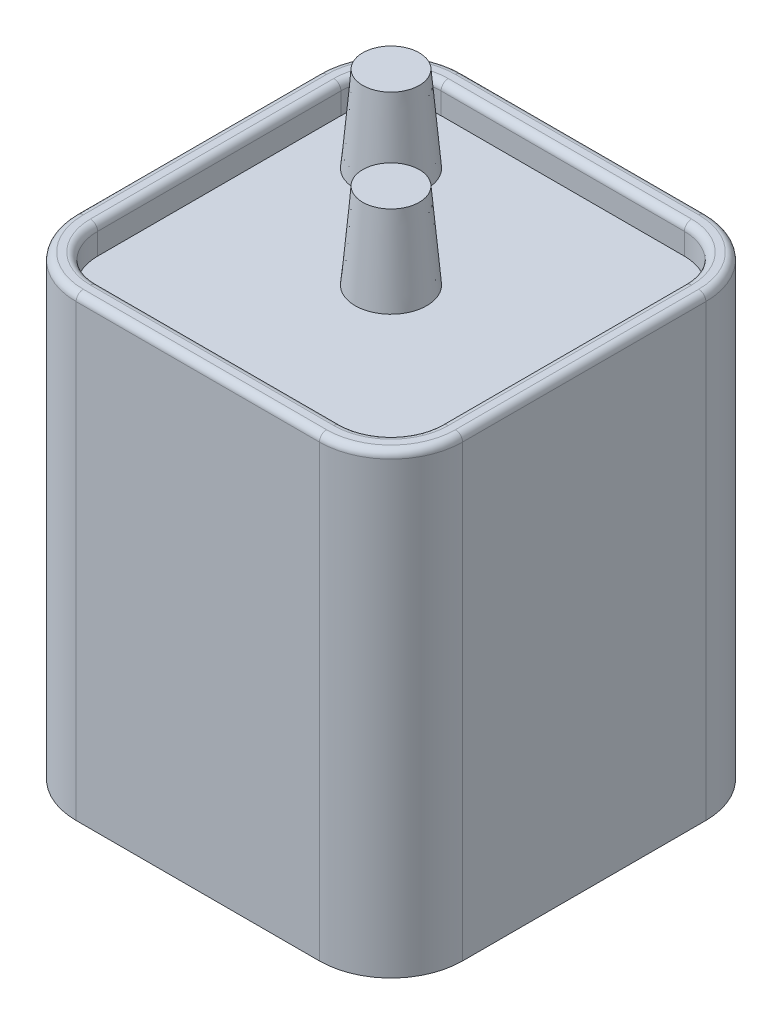
ISO-10303-21;
HEADER;
FILE_DESCRIPTION(('STEP AP214'),'2;1');
FILE_NAME('part.step','',(''),(''),'','','');
FILE_SCHEMA(('AUTOMOTIVE_DESIGN { 1 0 10303 214 1 1 1 1 }'));
ENDSEC;
DATA;
#1=APPLICATION_CONTEXT('core data for automotive mechanical design processes');
#2=APPLICATION_PROTOCOL_DEFINITION('international standard','automotive_design',2000,#1);
#3=PRODUCT_CONTEXT('',#1,'mechanical');
#4=PRODUCT('Part','Part','',(#3));
#5=PRODUCT_RELATED_PRODUCT_CATEGORY('part','',(#4));
#6=PRODUCT_DEFINITION_FORMATION('','',#4);
#7=PRODUCT_DEFINITION_CONTEXT('part definition',#1,'design');
#8=PRODUCT_DEFINITION('design','',#6,#7);
#9=PRODUCT_DEFINITION_SHAPE('','',#8);
#10=(LENGTH_UNIT() NAMED_UNIT(*) SI_UNIT(.MILLI.,.METRE.));
#11=(NAMED_UNIT(*) PLANE_ANGLE_UNIT() SI_UNIT($,.RADIAN.));
#12=(NAMED_UNIT(*) SI_UNIT($,.STERADIAN.) SOLID_ANGLE_UNIT());
#13=UNCERTAINTY_MEASURE_WITH_UNIT(LENGTH_MEASURE(1.E-05),#10,'distance_accuracy_value','');
#14=(GEOMETRIC_REPRESENTATION_CONTEXT(3) GLOBAL_UNCERTAINTY_ASSIGNED_CONTEXT((#13)) GLOBAL_UNIT_ASSIGNED_CONTEXT((#10,
#11,#12)) REPRESENTATION_CONTEXT('',''));
#15=CARTESIAN_POINT('',(0.,0.,0.));
#16=DIRECTION('',(0.,0.,1.));
#17=DIRECTION('',(1.,0.,0.));
#18=AXIS2_PLACEMENT_3D('',#15,#16,#17);
#19=CARTESIAN_POINT('',(34.29,81.026,34.29));
#20=DIRECTION('',(-1.,0.,0.));
#21=DIRECTION('',(0.,0.,1.));
#22=AXIS2_PLACEMENT_3D('',#19,#20,#21);
#23=PLANE('',#22);
#24=DIRECTION('',(0.,-1.,0.));
#25=VECTOR('',#24,1.);
#26=CARTESIAN_POINT('',(34.29,81.026,-21.59));
#27=LINE('',#26,#25);
#28=CARTESIAN_POINT('',(34.29,0.,-21.59));
#29=VERTEX_POINT('',#28);
#30=CARTESIAN_POINT('',(34.29,79.756,-21.59));
#31=VERTEX_POINT('',#30);
#32=EDGE_CURVE('E326',#29,#31,#27,.F.);
#33=ORIENTED_EDGE('',*,*,#32,.T.);
#34=DIRECTION('',(0.,0.,-1.));
#35=VECTOR('',#34,1.);
#36=CARTESIAN_POINT('',(34.29,79.756,34.29));
#37=LINE('',#36,#35);
#38=CARTESIAN_POINT('',(34.29,79.756,21.59));
#39=VERTEX_POINT('',#38);
#40=EDGE_CURVE('E391',#31,#39,#37,.F.);
#41=ORIENTED_EDGE('',*,*,#40,.T.);
#42=DIRECTION('',(0.,-1.,0.));
#43=VECTOR('',#42,1.);
#44=CARTESIAN_POINT('',(34.29,81.026,21.59));
#45=LINE('',#44,#43);
#46=CARTESIAN_POINT('',(34.29,0.,21.59));
#47=VERTEX_POINT('',#46);
#48=EDGE_CURVE('E323',#39,#47,#45,.T.);
#49=ORIENTED_EDGE('',*,*,#48,.T.);
#50=DIRECTION('',(0.,0.,-1.));
#51=VECTOR('',#50,1.);
#52=CARTESIAN_POINT('',(34.29,0.,34.29));
#53=LINE('',#52,#51);
#54=EDGE_CURVE('E260',#47,#29,#53,.T.);
#55=ORIENTED_EDGE('',*,*,#54,.T.);
#56=EDGE_LOOP('',(#33,#41,#49,#55));
#57=FACE_BOUND('',#56,.T.);
#58=ADVANCED_FACE('F41',(#57),#23,.F.);
#59=CARTESIAN_POINT('',(-34.29,81.026,-34.29));
#60=DIRECTION('',(0.,0.,1.));
#61=DIRECTION('',(1.,0.,0.));
#62=AXIS2_PLACEMENT_3D('',#59,#60,#61);
#63=PLANE('',#62);
#64=DIRECTION('',(0.,-1.,0.));
#65=VECTOR('',#64,1.);
#66=CARTESIAN_POINT('',(-21.59,81.026,-34.29));
#67=LINE('',#66,#65);
#68=CARTESIAN_POINT('',(-21.59,0.,-34.29));
#69=VERTEX_POINT('',#68);
#70=CARTESIAN_POINT('',(-21.59,79.756,-34.29));
#71=VERTEX_POINT('',#70);
#72=EDGE_CURVE('E319',#69,#71,#67,.F.);
#73=ORIENTED_EDGE('',*,*,#72,.T.);
#74=DIRECTION('',(-1.,0.,0.));
#75=VECTOR('',#74,1.);
#76=CARTESIAN_POINT('',(-34.29,79.756,-34.29));
#77=LINE('',#76,#75);
#78=CARTESIAN_POINT('',(21.59,79.756,-34.29));
#79=VERTEX_POINT('',#78);
#80=EDGE_CURVE('E409',#71,#79,#77,.F.);
#81=ORIENTED_EDGE('',*,*,#80,.T.);
#82=DIRECTION('',(0.,-1.,0.));
#83=VECTOR('',#82,1.);
#84=CARTESIAN_POINT('',(21.59,81.026,-34.29));
#85=LINE('',#84,#83);
#86=CARTESIAN_POINT('',(21.59,0.,-34.29));
#87=VERTEX_POINT('',#86);
#88=EDGE_CURVE('E316',#79,#87,#85,.T.);
#89=ORIENTED_EDGE('',*,*,#88,.T.);
#90=DIRECTION('',(-1.,0.,0.));
#91=VECTOR('',#90,1.);
#92=CARTESIAN_POINT('',(-34.29,0.,-34.29));
#93=LINE('',#92,#91);
#94=EDGE_CURVE('E285',#87,#69,#93,.T.);
#95=ORIENTED_EDGE('',*,*,#94,.T.);
#96=EDGE_LOOP('',(#73,#81,#89,#95));
#97=FACE_BOUND('',#96,.T.);
#98=ADVANCED_FACE('F533',(#97),#63,.F.);
#99=CARTESIAN_POINT('',(-34.29,81.026,34.29));
#100=DIRECTION('',(1.,0.,0.));
#101=DIRECTION('',(0.,0.,-1.));
#102=AXIS2_PLACEMENT_3D('',#99,#100,#101);
#103=PLANE('',#102);
#104=DIRECTION('',(0.,-1.,0.));
#105=VECTOR('',#104,1.);
#106=CARTESIAN_POINT('',(-34.29,81.026,21.59));
#107=LINE('',#106,#105);
#108=CARTESIAN_POINT('',(-34.29,0.,21.59));
#109=VERTEX_POINT('',#108);
#110=CARTESIAN_POINT('',(-34.29,79.756,21.59));
#111=VERTEX_POINT('',#110);
#112=EDGE_CURVE('E297',#109,#111,#107,.F.);
#113=ORIENTED_EDGE('',*,*,#112,.T.);
#114=DIRECTION('',(0.,0.,1.));
#115=VECTOR('',#114,1.);
#116=CARTESIAN_POINT('',(-34.29,79.756,34.29));
#117=LINE('',#116,#115);
#118=CARTESIAN_POINT('',(-34.29,79.756,-21.59));
#119=VERTEX_POINT('',#118);
#120=EDGE_CURVE('E403',#111,#119,#117,.F.);
#121=ORIENTED_EDGE('',*,*,#120,.T.);
#122=DIRECTION('',(0.,-1.,0.));
#123=VECTOR('',#122,1.);
#124=CARTESIAN_POINT('',(-34.29,81.026,-21.59));
#125=LINE('',#124,#123);
#126=CARTESIAN_POINT('',(-34.29,0.,-21.59));
#127=VERTEX_POINT('',#126);
#128=EDGE_CURVE('E301',#119,#127,#125,.T.);
#129=ORIENTED_EDGE('',*,*,#128,.T.);
#130=DIRECTION('',(0.,0.,1.));
#131=VECTOR('',#130,1.);
#132=CARTESIAN_POINT('',(-34.29,0.,34.29));
#133=LINE('',#132,#131);
#134=EDGE_CURVE('E289',#127,#109,#133,.T.);
#135=ORIENTED_EDGE('',*,*,#134,.T.);
#136=EDGE_LOOP('',(#113,#121,#129,#135));
#137=FACE_BOUND('',#136,.T.);
#138=ADVANCED_FACE('F539',(#137),#103,.F.);
#139=CARTESIAN_POINT('',(-34.29,81.026,34.29));
#140=DIRECTION('',(0.,0.,-1.));
#141=DIRECTION('',(-1.,0.,0.));
#142=AXIS2_PLACEMENT_3D('',#139,#140,#141);
#143=PLANE('',#142);
#144=DIRECTION('',(0.,-1.,0.));
#145=VECTOR('',#144,1.);
#146=CARTESIAN_POINT('',(21.59,81.026,34.29));
#147=LINE('',#146,#145);
#148=CARTESIAN_POINT('',(21.59,0.,34.29));
#149=VERTEX_POINT('',#148);
#150=CARTESIAN_POINT('',(21.59,79.756,34.29));
#151=VERTEX_POINT('',#150);
#152=EDGE_CURVE('E333',#149,#151,#147,.F.);
#153=ORIENTED_EDGE('',*,*,#152,.T.);
#154=DIRECTION('',(1.,0.,0.));
#155=VECTOR('',#154,1.);
#156=CARTESIAN_POINT('',(-34.29,79.756,34.29));
#157=LINE('',#156,#155);
#158=CARTESIAN_POINT('',(-21.59,79.756,34.29));
#159=VERTEX_POINT('',#158);
#160=EDGE_CURVE('E397',#151,#159,#157,.F.);
#161=ORIENTED_EDGE('',*,*,#160,.T.);
#162=DIRECTION('',(0.,-1.,0.));
#163=VECTOR('',#162,1.);
#164=CARTESIAN_POINT('',(-21.59,81.026,34.29));
#165=LINE('',#164,#163);
#166=CARTESIAN_POINT('',(-21.59,0.,34.29));
#167=VERTEX_POINT('',#166);
#168=EDGE_CURVE('E330',#159,#167,#165,.T.);
#169=ORIENTED_EDGE('',*,*,#168,.T.);
#170=DIRECTION('',(1.,0.,0.));
#171=VECTOR('',#170,1.);
#172=CARTESIAN_POINT('',(-34.29,0.,34.29));
#173=LINE('',#172,#171);
#174=EDGE_CURVE('E293',#167,#149,#173,.T.);
#175=ORIENTED_EDGE('',*,*,#174,.T.);
#176=EDGE_LOOP('',(#153,#161,#169,#175));
#177=FACE_BOUND('',#176,.T.);
#178=ADVANCED_FACE('F740',(#177),#143,.F.);
#179=CARTESIAN_POINT('',(0.,81.026,0.));
#180=DIRECTION('',(0.,-1.,0.));
#181=DIRECTION('',(0.,0.,-1.));
#182=AXIS2_PLACEMENT_3D('',#179,#180,#181);
#183=PLANE('',#182);
#184=DIRECTION('',(0.,0.,-1.));
#185=VECTOR('',#184,1.);
#186=CARTESIAN_POINT('',(33.02,81.026,0.));
#187=LINE('',#186,#185);
#188=CARTESIAN_POINT('',(33.02,81.026,21.59));
#189=VERTEX_POINT('',#188);
#190=CARTESIAN_POINT('',(33.02,81.026,-21.59));
#191=VERTEX_POINT('',#190);
#192=EDGE_CURVE('E380',#189,#191,#187,.T.);
#193=ORIENTED_EDGE('',*,*,#192,.T.);
#194=CARTESIAN_POINT('',(21.59,81.026,-21.59));
#195=DIRECTION('',(0.,-1.,0.));
#196=DIRECTION('',(0.,0.,-1.));
#197=AXIS2_PLACEMENT_3D('',#194,#195,#196);
#198=CIRCLE('',#197,11.43);
#199=CARTESIAN_POINT('',(21.59,81.026,-33.02));
#200=VERTEX_POINT('',#199);
#201=EDGE_CURVE('E383',#191,#200,#198,.F.);
#202=ORIENTED_EDGE('',*,*,#201,.T.);
#203=DIRECTION('',(-1.,0.,0.));
#204=VECTOR('',#203,1.);
#205=CARTESIAN_POINT('',(0.,81.026,-33.02));
#206=LINE('',#205,#204);
#207=CARTESIAN_POINT('',(-21.59,81.026,-33.02));
#208=VERTEX_POINT('',#207);
#209=EDGE_CURVE('E362',#200,#208,#206,.T.);
#210=ORIENTED_EDGE('',*,*,#209,.T.);
#211=CARTESIAN_POINT('',(-21.59,81.026,-21.59));
#212=DIRECTION('',(0.,-1.,0.));
#213=DIRECTION('',(0.,0.,-1.));
#214=AXIS2_PLACEMENT_3D('',#211,#212,#213);
#215=CIRCLE('',#214,11.43);
#216=CARTESIAN_POINT('',(-33.02,81.026,-21.59));
#217=VERTEX_POINT('',#216);
#218=EDGE_CURVE('E365',#208,#217,#215,.F.);
#219=ORIENTED_EDGE('',*,*,#218,.T.);
#220=DIRECTION('',(0.,0.,1.));
#221=VECTOR('',#220,1.);
#222=CARTESIAN_POINT('',(-33.02,81.026,0.));
#223=LINE('',#222,#221);
#224=CARTESIAN_POINT('',(-33.02,81.026,21.59));
#225=VERTEX_POINT('',#224);
#226=EDGE_CURVE('E368',#217,#225,#223,.T.);
#227=ORIENTED_EDGE('',*,*,#226,.T.);
#228=CARTESIAN_POINT('',(-21.59,81.026,21.59));
#229=DIRECTION('',(0.,-1.,0.));
#230=DIRECTION('',(0.,0.,-1.));
#231=AXIS2_PLACEMENT_3D('',#228,#229,#230);
#232=CIRCLE('',#231,11.43);
#233=CARTESIAN_POINT('',(-21.59,81.026,33.02));
#234=VERTEX_POINT('',#233);
#235=EDGE_CURVE('E371',#225,#234,#232,.F.);
#236=ORIENTED_EDGE('',*,*,#235,.T.);
#237=DIRECTION('',(1.,0.,0.));
#238=VECTOR('',#237,1.);
#239=CARTESIAN_POINT('',(0.,81.026,33.02));
#240=LINE('',#239,#238);
#241=CARTESIAN_POINT('',(21.59,81.026,33.02));
#242=VERTEX_POINT('',#241);
#243=EDGE_CURVE('E374',#234,#242,#240,.T.);
#244=ORIENTED_EDGE('',*,*,#243,.T.);
#245=CARTESIAN_POINT('',(21.59,81.026,21.59));
#246=DIRECTION('',(0.,-1.,0.));
#247=DIRECTION('',(0.,0.,-1.));
#248=AXIS2_PLACEMENT_3D('',#245,#246,#247);
#249=CIRCLE('',#248,11.43);
#250=EDGE_CURVE('E377',#242,#189,#249,.F.);
#251=ORIENTED_EDGE('',*,*,#250,.T.);
#252=EDGE_LOOP('',(#193,#202,#210,#219,#227,#236,#244,#251));
#253=FACE_BOUND('',#252,.T.);
#254=DIRECTION('',(0.,0.,1.));
#255=VECTOR('',#254,1.);
#256=CARTESIAN_POINT('',(-31.75,81.026,0.));
#257=LINE('',#256,#255);
#258=CARTESIAN_POINT('',(-31.75,81.026,21.59));
#259=VERTEX_POINT('',#258);
#260=CARTESIAN_POINT('',(-31.75,81.026,-21.59));
#261=VERTEX_POINT('',#260);
#262=EDGE_CURVE('E355',#259,#261,#257,.F.);
#263=ORIENTED_EDGE('',*,*,#262,.T.);
#264=CARTESIAN_POINT('',(-21.59,81.026,-21.59));
#265=DIRECTION('',(0.,-1.,0.));
#266=DIRECTION('',(0.,0.,-1.));
#267=AXIS2_PLACEMENT_3D('',#264,#265,#266);
#268=CIRCLE('',#267,10.16);
#269=CARTESIAN_POINT('',(-21.59,81.026,-31.75));
#270=VERTEX_POINT('',#269);
#271=EDGE_CURVE('E358',#261,#270,#268,.T.);
#272=ORIENTED_EDGE('',*,*,#271,.T.);
#273=DIRECTION('',(-1.,0.,0.));
#274=VECTOR('',#273,1.);
#275=CARTESIAN_POINT('',(0.,81.026,-31.75));
#276=LINE('',#275,#274);
#277=CARTESIAN_POINT('',(21.59,81.026,-31.75));
#278=VERTEX_POINT('',#277);
#279=EDGE_CURVE('E337',#270,#278,#276,.F.);
#280=ORIENTED_EDGE('',*,*,#279,.T.);
#281=CARTESIAN_POINT('',(21.59,81.026,-21.59));
#282=DIRECTION('',(0.,-1.,0.));
#283=DIRECTION('',(0.,0.,-1.));
#284=AXIS2_PLACEMENT_3D('',#281,#282,#283);
#285=CIRCLE('',#284,10.16);
#286=CARTESIAN_POINT('',(31.75,81.026,-21.59));
#287=VERTEX_POINT('',#286);
#288=EDGE_CURVE('E340',#278,#287,#285,.T.);
#289=ORIENTED_EDGE('',*,*,#288,.T.);
#290=DIRECTION('',(0.,0.,-1.));
#291=VECTOR('',#290,1.);
#292=CARTESIAN_POINT('',(31.75,81.026,0.));
#293=LINE('',#292,#291);
#294=CARTESIAN_POINT('',(31.75,81.026,21.59));
#295=VERTEX_POINT('',#294);
#296=EDGE_CURVE('E343',#287,#295,#293,.F.);
#297=ORIENTED_EDGE('',*,*,#296,.T.);
#298=CARTESIAN_POINT('',(21.59,81.026,21.59));
#299=DIRECTION('',(0.,-1.,0.));
#300=DIRECTION('',(0.,0.,-1.));
#301=AXIS2_PLACEMENT_3D('',#298,#299,#300);
#302=CIRCLE('',#301,10.16);
#303=CARTESIAN_POINT('',(21.59,81.026,31.75));
#304=VERTEX_POINT('',#303);
#305=EDGE_CURVE('E346',#295,#304,#302,.T.);
#306=ORIENTED_EDGE('',*,*,#305,.T.);
#307=DIRECTION('',(1.,0.,0.));
#308=VECTOR('',#307,1.);
#309=CARTESIAN_POINT('',(0.,81.026,31.75));
#310=LINE('',#309,#308);
#311=CARTESIAN_POINT('',(-21.59,81.026,31.75));
#312=VERTEX_POINT('',#311);
#313=EDGE_CURVE('E349',#304,#312,#310,.F.);
#314=ORIENTED_EDGE('',*,*,#313,.T.);
#315=CARTESIAN_POINT('',(-21.59,81.026,21.59));
#316=DIRECTION('',(0.,-1.,0.));
#317=DIRECTION('',(0.,0.,-1.));
#318=AXIS2_PLACEMENT_3D('',#315,#316,#317);
#319=CIRCLE('',#318,10.16);
#320=EDGE_CURVE('E352',#312,#259,#319,.T.);
#321=ORIENTED_EDGE('',*,*,#320,.T.);
#322=EDGE_LOOP('',(#263,#272,#280,#289,#297,#306,#314,#321));
#323=FACE_BOUND('',#322,.T.);
#324=ADVANCED_FACE('F496',(#253,#323),#183,.F.);
#325=CARTESIAN_POINT('',(0.,0.,0.));
#326=DIRECTION('',(0.,-1.,0.));
#327=DIRECTION('',(0.,0.,-1.));
#328=AXIS2_PLACEMENT_3D('',#325,#326,#327);
#329=PLANE('',#328);
#330=ORIENTED_EDGE('',*,*,#134,.F.);
#331=CARTESIAN_POINT('',(-21.59,0.,-21.59));
#332=DIRECTION('',(0.,-1.,0.));
#333=DIRECTION('',(0.,0.,-1.));
#334=AXIS2_PLACEMENT_3D('',#331,#332,#333);
#335=CIRCLE('',#334,12.7);
#336=EDGE_CURVE('E313',#127,#69,#335,.T.);
#337=ORIENTED_EDGE('',*,*,#336,.T.);
#338=ORIENTED_EDGE('',*,*,#94,.F.);
#339=CARTESIAN_POINT('',(21.59,0.,-21.59));
#340=DIRECTION('',(0.,-1.,0.));
#341=DIRECTION('',(0.,0.,-1.));
#342=AXIS2_PLACEMENT_3D('',#339,#340,#341);
#343=CIRCLE('',#342,12.7);
#344=EDGE_CURVE('E310',#87,#29,#343,.T.);
#345=ORIENTED_EDGE('',*,*,#344,.T.);
#346=ORIENTED_EDGE('',*,*,#54,.F.);
#347=CARTESIAN_POINT('',(21.59,0.,21.59));
#348=DIRECTION('',(0.,-1.,0.));
#349=DIRECTION('',(0.,0.,-1.));
#350=AXIS2_PLACEMENT_3D('',#347,#348,#349);
#351=CIRCLE('',#350,12.7);
#352=EDGE_CURVE('E307',#47,#149,#351,.T.);
#353=ORIENTED_EDGE('',*,*,#352,.T.);
#354=ORIENTED_EDGE('',*,*,#174,.F.);
#355=CARTESIAN_POINT('',(-21.59,0.,21.59));
#356=DIRECTION('',(0.,-1.,0.));
#357=DIRECTION('',(0.,0.,-1.));
#358=AXIS2_PLACEMENT_3D('',#355,#356,#357);
#359=CIRCLE('',#358,12.7);
#360=EDGE_CURVE('E304',#167,#109,#359,.T.);
#361=ORIENTED_EDGE('',*,*,#360,.T.);
#362=EDGE_LOOP('',(#330,#337,#338,#345,#346,#353,#354,#361));
#363=FACE_BOUND('',#362,.T.);
#364=ADVANCED_FACE('F548',(#363),#329,.T.);
#365=CARTESIAN_POINT('',(-21.59,81.026,-21.59));
#366=DIRECTION('',(0.,-1.,0.));
#367=DIRECTION('',(0.,0.,-1.));
#368=AXIS2_PLACEMENT_3D('',#365,#366,#367);
#369=CYLINDRICAL_SURFACE('',#368,12.7);
#370=ORIENTED_EDGE('',*,*,#128,.F.);
#371=CARTESIAN_POINT('',(-21.59,79.756,-21.59));
#372=DIRECTION('',(0.,-1.,0.));
#373=DIRECTION('',(0.,0.,-1.));
#374=AXIS2_PLACEMENT_3D('',#371,#372,#373);
#375=CIRCLE('',#374,12.7);
#376=EDGE_CURVE('E406',#119,#71,#375,.T.);
#377=ORIENTED_EDGE('',*,*,#376,.T.);
#378=ORIENTED_EDGE('',*,*,#72,.F.);
#379=ORIENTED_EDGE('',*,*,#336,.F.);
#380=EDGE_LOOP('',(#370,#377,#378,#379));
#381=FACE_BOUND('',#380,.T.);
#382=ADVANCED_FACE('F544',(#381),#369,.T.);
#383=CARTESIAN_POINT('',(21.59,81.026,-21.59));
#384=DIRECTION('',(0.,-1.,0.));
#385=DIRECTION('',(0.,0.,-1.));
#386=AXIS2_PLACEMENT_3D('',#383,#384,#385);
#387=CYLINDRICAL_SURFACE('',#386,12.7);
#388=ORIENTED_EDGE('',*,*,#88,.F.);
#389=CARTESIAN_POINT('',(21.59,79.756,-21.59));
#390=DIRECTION('',(0.,-1.,0.));
#391=DIRECTION('',(0.,0.,-1.));
#392=AXIS2_PLACEMENT_3D('',#389,#390,#391);
#393=CIRCLE('',#392,12.7);
#394=EDGE_CURVE('E387',#79,#31,#393,.T.);
#395=ORIENTED_EDGE('',*,*,#394,.T.);
#396=ORIENTED_EDGE('',*,*,#32,.F.);
#397=ORIENTED_EDGE('',*,*,#344,.F.);
#398=EDGE_LOOP('',(#388,#395,#396,#397));
#399=FACE_BOUND('',#398,.T.);
#400=ADVANCED_FACE('F547',(#399),#387,.T.);
#401=CARTESIAN_POINT('',(21.59,81.026,21.59));
#402=DIRECTION('',(0.,-1.,0.));
#403=DIRECTION('',(0.,0.,-1.));
#404=AXIS2_PLACEMENT_3D('',#401,#402,#403);
#405=CYLINDRICAL_SURFACE('',#404,12.7);
#406=ORIENTED_EDGE('',*,*,#48,.F.);
#407=CARTESIAN_POINT('',(21.59,79.756,21.59));
#408=DIRECTION('',(0.,-1.,0.));
#409=DIRECTION('',(0.,0.,-1.));
#410=AXIS2_PLACEMENT_3D('',#407,#408,#409);
#411=CIRCLE('',#410,12.7);
#412=EDGE_CURVE('E394',#39,#151,#411,.T.);
#413=ORIENTED_EDGE('',*,*,#412,.T.);
#414=ORIENTED_EDGE('',*,*,#152,.F.);
#415=ORIENTED_EDGE('',*,*,#352,.F.);
#416=EDGE_LOOP('',(#406,#413,#414,#415));
#417=FACE_BOUND('',#416,.T.);
#418=ADVANCED_FACE('F552',(#417),#405,.T.);
#419=CARTESIAN_POINT('',(-21.59,81.026,21.59));
#420=DIRECTION('',(0.,-1.,0.));
#421=DIRECTION('',(0.,0.,-1.));
#422=AXIS2_PLACEMENT_3D('',#419,#420,#421);
#423=CYLINDRICAL_SURFACE('',#422,12.7);
#424=ORIENTED_EDGE('',*,*,#168,.F.);
#425=CARTESIAN_POINT('',(-21.59,79.756,21.59));
#426=DIRECTION('',(0.,-1.,0.));
#427=DIRECTION('',(0.,0.,-1.));
#428=AXIS2_PLACEMENT_3D('',#425,#426,#427);
#429=CIRCLE('',#428,12.7);
#430=EDGE_CURVE('E400',#159,#111,#429,.T.);
#431=ORIENTED_EDGE('',*,*,#430,.T.);
#432=ORIENTED_EDGE('',*,*,#112,.F.);
#433=ORIENTED_EDGE('',*,*,#360,.F.);
#434=EDGE_LOOP('',(#424,#431,#432,#433));
#435=FACE_BOUND('',#434,.T.);
#436=ADVANCED_FACE('F556',(#435),#423,.T.);
#437=CARTESIAN_POINT('',(21.59,75.946,-21.59));
#438=DIRECTION('',(0.,1.,0.));
#439=DIRECTION('',(0.,0.,1.));
#440=AXIS2_PLACEMENT_3D('',#437,#438,#439);
#441=CYLINDRICAL_SURFACE('',#440,8.89);
#442=DIRECTION('',(0.,1.,0.));
#443=VECTOR('',#442,1.);
#444=CARTESIAN_POINT('',(30.48,75.946,-21.59));
#445=LINE('',#444,#443);
#446=CARTESIAN_POINT('',(30.48,75.946,-21.59));
#447=VERTEX_POINT('',#446);
#448=CARTESIAN_POINT('',(30.48,79.756,-21.59));
#449=VERTEX_POINT('',#448);
#450=EDGE_CURVE('E257',#447,#449,#445,.T.);
#451=ORIENTED_EDGE('',*,*,#450,.T.);
#452=CARTESIAN_POINT('',(21.59,79.756,-21.59));
#453=DIRECTION('',(0.,-1.,0.));
#454=DIRECTION('',(0.,0.,-1.));
#455=AXIS2_PLACEMENT_3D('',#452,#453,#454);
#456=CIRCLE('',#455,8.89);
#457=CARTESIAN_POINT('',(21.59,79.756,-30.48));
#458=VERTEX_POINT('',#457);
#459=EDGE_CURVE('E51',#449,#458,#456,.F.);
#460=ORIENTED_EDGE('',*,*,#459,.T.);
#461=DIRECTION('',(0.,1.,0.));
#462=VECTOR('',#461,1.);
#463=CARTESIAN_POINT('',(21.59,75.946,-30.48));
#464=LINE('',#463,#462);
#465=CARTESIAN_POINT('',(21.59,75.946,-30.48));
#466=VERTEX_POINT('',#465);
#467=EDGE_CURVE('E202',#466,#458,#464,.T.);
#468=ORIENTED_EDGE('',*,*,#467,.F.);
#469=CARTESIAN_POINT('',(21.59,75.946,-21.59));
#470=DIRECTION('',(0.,1.,0.));
#471=DIRECTION('',(0.,0.,1.));
#472=AXIS2_PLACEMENT_3D('',#469,#470,#471);
#473=CIRCLE('',#472,8.89);
#474=EDGE_CURVE('E206',#447,#466,#473,.T.);
#475=ORIENTED_EDGE('',*,*,#474,.F.);
#476=EDGE_LOOP('',(#451,#460,#468,#475));
#477=FACE_BOUND('',#476,.T.);
#478=ADVANCED_FACE('F204',(#477),#441,.F.);
#479=CARTESIAN_POINT('',(30.48,75.946,21.59));
#480=DIRECTION('',(1.,0.,0.));
#481=DIRECTION('',(0.,0.,-1.));
#482=AXIS2_PLACEMENT_3D('',#479,#480,#481);
#483=PLANE('',#482);
#484=DIRECTION('',(0.,1.,0.));
#485=VECTOR('',#484,1.);
#486=CARTESIAN_POINT('',(30.48,75.946,21.59));
#487=LINE('',#486,#485);
#488=CARTESIAN_POINT('',(30.48,75.946,21.59));
#489=VERTEX_POINT('',#488);
#490=CARTESIAN_POINT('',(30.48,79.756,21.59));
#491=VERTEX_POINT('',#490);
#492=EDGE_CURVE('E261',#489,#491,#487,.T.);
#493=ORIENTED_EDGE('',*,*,#492,.T.);
#494=DIRECTION('',(0.,0.,-1.));
#495=VECTOR('',#494,1.);
#496=CARTESIAN_POINT('',(30.48,79.756,21.59));
#497=LINE('',#496,#495);
#498=EDGE_CURVE('E66',#491,#449,#497,.T.);
#499=ORIENTED_EDGE('',*,*,#498,.T.);
#500=ORIENTED_EDGE('',*,*,#450,.F.);
#501=DIRECTION('',(0.,0.,-1.));
#502=VECTOR('',#501,1.);
#503=CARTESIAN_POINT('',(30.48,75.946,21.59));
#504=LINE('',#503,#502);
#505=EDGE_CURVE('E212',#489,#447,#504,.T.);
#506=ORIENTED_EDGE('',*,*,#505,.F.);
#507=EDGE_LOOP('',(#493,#499,#500,#506));
#508=FACE_BOUND('',#507,.T.);
#509=ADVANCED_FACE('F522',(#508),#483,.F.);
#510=CARTESIAN_POINT('',(21.59,75.946,21.59));
#511=DIRECTION('',(0.,1.,0.));
#512=DIRECTION('',(0.,0.,1.));
#513=AXIS2_PLACEMENT_3D('',#510,#511,#512);
#514=CYLINDRICAL_SURFACE('',#513,8.89);
#515=DIRECTION('',(0.,1.,0.));
#516=VECTOR('',#515,1.);
#517=CARTESIAN_POINT('',(21.59,75.946,30.48));
#518=LINE('',#517,#516);
#519=CARTESIAN_POINT('',(21.59,75.946,30.48));
#520=VERTEX_POINT('',#519);
#521=CARTESIAN_POINT('',(21.59,79.756,30.48));
#522=VERTEX_POINT('',#521);
#523=EDGE_CURVE('E264',#520,#522,#518,.T.);
#524=ORIENTED_EDGE('',*,*,#523,.T.);
#525=CARTESIAN_POINT('',(21.59,79.756,21.59));
#526=DIRECTION('',(0.,-1.,0.));
#527=DIRECTION('',(0.,0.,-1.));
#528=AXIS2_PLACEMENT_3D('',#525,#526,#527);
#529=CIRCLE('',#528,8.89);
#530=EDGE_CURVE('E425',#522,#491,#529,.F.);
#531=ORIENTED_EDGE('',*,*,#530,.T.);
#532=ORIENTED_EDGE('',*,*,#492,.F.);
#533=CARTESIAN_POINT('',(21.59,75.946,21.59));
#534=DIRECTION('',(0.,1.,0.));
#535=DIRECTION('',(0.,0.,1.));
#536=AXIS2_PLACEMENT_3D('',#533,#534,#535);
#537=CIRCLE('',#536,8.89);
#538=EDGE_CURVE('E252',#520,#489,#537,.T.);
#539=ORIENTED_EDGE('',*,*,#538,.F.);
#540=EDGE_LOOP('',(#524,#531,#532,#539));
#541=FACE_BOUND('',#540,.T.);
#542=ADVANCED_FACE('F523',(#541),#514,.F.);
#543=CARTESIAN_POINT('',(-21.59,75.946,30.48));
#544=DIRECTION('',(0.,0.,1.));
#545=DIRECTION('',(1.,0.,0.));
#546=AXIS2_PLACEMENT_3D('',#543,#544,#545);
#547=PLANE('',#546);
#548=DIRECTION('',(0.,1.,0.));
#549=VECTOR('',#548,1.);
#550=CARTESIAN_POINT('',(-21.59,75.946,30.48));
#551=LINE('',#550,#549);
#552=CARTESIAN_POINT('',(-21.59,75.946,30.48));
#553=VERTEX_POINT('',#552);
#554=CARTESIAN_POINT('',(-21.59,79.756,30.48));
#555=VERTEX_POINT('',#554);
#556=EDGE_CURVE('E268',#553,#555,#551,.T.);
#557=ORIENTED_EDGE('',*,*,#556,.T.);
#558=DIRECTION('',(1.,0.,0.));
#559=VECTOR('',#558,1.);
#560=CARTESIAN_POINT('',(-21.59,79.756,30.48));
#561=LINE('',#560,#559);
#562=EDGE_CURVE('E422',#555,#522,#561,.T.);
#563=ORIENTED_EDGE('',*,*,#562,.T.);
#564=ORIENTED_EDGE('',*,*,#523,.F.);
#565=DIRECTION('',(1.,0.,0.));
#566=VECTOR('',#565,1.);
#567=CARTESIAN_POINT('',(-21.59,75.946,30.48));
#568=LINE('',#567,#566);
#569=EDGE_CURVE('E248',#553,#520,#568,.T.);
#570=ORIENTED_EDGE('',*,*,#569,.F.);
#571=EDGE_LOOP('',(#557,#563,#564,#570));
#572=FACE_BOUND('',#571,.T.);
#573=ADVANCED_FACE('F519',(#572),#547,.F.);
#574=CARTESIAN_POINT('',(-21.59,75.946,21.59));
#575=DIRECTION('',(0.,1.,0.));
#576=DIRECTION('',(0.,0.,1.));
#577=AXIS2_PLACEMENT_3D('',#574,#575,#576);
#578=CYLINDRICAL_SURFACE('',#577,8.89);
#579=DIRECTION('',(0.,1.,0.));
#580=VECTOR('',#579,1.);
#581=CARTESIAN_POINT('',(-30.48,75.946,21.59));
#582=LINE('',#581,#580);
#583=CARTESIAN_POINT('',(-30.48,75.946,21.59));
#584=VERTEX_POINT('',#583);
#585=CARTESIAN_POINT('',(-30.48,79.756,21.59));
#586=VERTEX_POINT('',#585);
#587=EDGE_CURVE('E272',#584,#586,#582,.T.);
#588=ORIENTED_EDGE('',*,*,#587,.T.);
#589=CARTESIAN_POINT('',(-21.59,79.756,21.59));
#590=DIRECTION('',(0.,-1.,0.));
#591=DIRECTION('',(0.,0.,-1.));
#592=AXIS2_PLACEMENT_3D('',#589,#590,#591);
#593=CIRCLE('',#592,8.89);
#594=EDGE_CURVE('E419',#586,#555,#593,.F.);
#595=ORIENTED_EDGE('',*,*,#594,.T.);
#596=ORIENTED_EDGE('',*,*,#556,.F.);
#597=CARTESIAN_POINT('',(-21.59,75.946,21.59));
#598=DIRECTION('',(0.,1.,0.));
#599=DIRECTION('',(0.,0.,1.));
#600=AXIS2_PLACEMENT_3D('',#597,#598,#599);
#601=CIRCLE('',#600,8.89);
#602=EDGE_CURVE('E244',#584,#553,#601,.T.);
#603=ORIENTED_EDGE('',*,*,#602,.F.);
#604=EDGE_LOOP('',(#588,#595,#596,#603));
#605=FACE_BOUND('',#604,.T.);
#606=ADVANCED_FACE('F516',(#605),#578,.F.);
#607=CARTESIAN_POINT('',(-30.48,75.946,-21.59));
#608=DIRECTION('',(-1.,0.,0.));
#609=DIRECTION('',(0.,0.,1.));
#610=AXIS2_PLACEMENT_3D('',#607,#608,#609);
#611=PLANE('',#610);
#612=DIRECTION('',(0.,1.,0.));
#613=VECTOR('',#612,1.);
#614=CARTESIAN_POINT('',(-30.48,75.946,-21.59));
#615=LINE('',#614,#613);
#616=CARTESIAN_POINT('',(-30.48,75.946,-21.59));
#617=VERTEX_POINT('',#616);
#618=CARTESIAN_POINT('',(-30.48,79.756,-21.59));
#619=VERTEX_POINT('',#618);
#620=EDGE_CURVE('E276',#617,#619,#615,.T.);
#621=ORIENTED_EDGE('',*,*,#620,.T.);
#622=DIRECTION('',(0.,0.,1.));
#623=VECTOR('',#622,1.);
#624=CARTESIAN_POINT('',(-30.48,79.756,-21.59));
#625=LINE('',#624,#623);
#626=EDGE_CURVE('E416',#619,#586,#625,.T.);
#627=ORIENTED_EDGE('',*,*,#626,.T.);
#628=ORIENTED_EDGE('',*,*,#587,.F.);
#629=DIRECTION('',(0.,0.,1.));
#630=VECTOR('',#629,1.);
#631=CARTESIAN_POINT('',(-30.48,75.946,-21.59));
#632=LINE('',#631,#630);
#633=EDGE_CURVE('E240',#617,#584,#632,.T.);
#634=ORIENTED_EDGE('',*,*,#633,.F.);
#635=EDGE_LOOP('',(#621,#627,#628,#634));
#636=FACE_BOUND('',#635,.T.);
#637=ADVANCED_FACE('F512',(#636),#611,.F.);
#638=CARTESIAN_POINT('',(-21.59,75.946,-21.59));
#639=DIRECTION('',(0.,1.,0.));
#640=DIRECTION('',(0.,0.,1.));
#641=AXIS2_PLACEMENT_3D('',#638,#639,#640);
#642=CYLINDRICAL_SURFACE('',#641,8.89);
#643=DIRECTION('',(0.,1.,0.));
#644=VECTOR('',#643,1.);
#645=CARTESIAN_POINT('',(-21.59,75.946,-30.48));
#646=LINE('',#645,#644);
#647=CARTESIAN_POINT('',(-21.59,75.946,-30.48));
#648=VERTEX_POINT('',#647);
#649=CARTESIAN_POINT('',(-21.59,79.756,-30.48));
#650=VERTEX_POINT('',#649);
#651=EDGE_CURVE('E211',#648,#650,#646,.T.);
#652=ORIENTED_EDGE('',*,*,#651,.T.);
#653=CARTESIAN_POINT('',(-21.59,79.756,-21.59));
#654=DIRECTION('',(0.,-1.,0.));
#655=DIRECTION('',(0.,0.,-1.));
#656=AXIS2_PLACEMENT_3D('',#653,#654,#655);
#657=CIRCLE('',#656,8.89);
#658=EDGE_CURVE('E412',#650,#619,#657,.F.);
#659=ORIENTED_EDGE('',*,*,#658,.T.);
#660=ORIENTED_EDGE('',*,*,#620,.F.);
#661=CARTESIAN_POINT('',(-21.59,75.946,-21.59));
#662=DIRECTION('',(0.,1.,0.));
#663=DIRECTION('',(0.,0.,1.));
#664=AXIS2_PLACEMENT_3D('',#661,#662,#663);
#665=CIRCLE('',#664,8.89);
#666=EDGE_CURVE('E222',#648,#617,#665,.T.);
#667=ORIENTED_EDGE('',*,*,#666,.F.);
#668=EDGE_LOOP('',(#652,#659,#660,#667));
#669=FACE_BOUND('',#668,.T.);
#670=ADVANCED_FACE('F508',(#669),#642,.F.);
#671=CARTESIAN_POINT('',(21.59,75.946,-30.48));
#672=DIRECTION('',(0.,0.,-1.));
#673=DIRECTION('',(-1.,0.,0.));
#674=AXIS2_PLACEMENT_3D('',#671,#672,#673);
#675=PLANE('',#674);
#676=ORIENTED_EDGE('',*,*,#467,.T.);
#677=DIRECTION('',(-1.,0.,0.));
#678=VECTOR('',#677,1.);
#679=CARTESIAN_POINT('',(21.59,79.756,-30.48));
#680=LINE('',#679,#678);
#681=EDGE_CURVE('E11',#458,#650,#680,.T.);
#682=ORIENTED_EDGE('',*,*,#681,.T.);
#683=ORIENTED_EDGE('',*,*,#651,.F.);
#684=DIRECTION('',(-1.,0.,0.));
#685=VECTOR('',#684,1.);
#686=CARTESIAN_POINT('',(21.59,75.946,-30.48));
#687=LINE('',#686,#685);
#688=EDGE_CURVE('E215',#466,#648,#687,.T.);
#689=ORIENTED_EDGE('',*,*,#688,.F.);
#690=EDGE_LOOP('',(#676,#682,#683,#689));
#691=FACE_BOUND('',#690,.T.);
#692=ADVANCED_FACE('F216',(#691),#675,.F.);
#693=CARTESIAN_POINT('',(21.59,75.946,-21.59));
#694=DIRECTION('',(0.,1.,0.));
#695=DIRECTION('',(0.,0.,1.));
#696=AXIS2_PLACEMENT_3D('',#693,#694,#695);
#697=PLANE('',#696);
#698=CARTESIAN_POINT('',(-17.9605122421382,75.946,-17.9605122421384));
#699=DIRECTION('',(0.,1.,0.));
#700=DIRECTION('',(0.,0.,1.));
#701=AXIS2_PLACEMENT_3D('',#698,#699,#700);
#702=CIRCLE('',#701,6.35);
#703=CARTESIAN_POINT('',(-17.9605122421382,75.946,-11.6105122421384));
#704=VERTEX_POINT('',#703);
#705=EDGE_CURVE('E928',#704,#704,#702,.T.);
#706=ORIENTED_EDGE('',*,*,#705,.F.);
#707=EDGE_LOOP('',(#706));
#708=FACE_BOUND('',#707,.T.);
#709=CARTESIAN_POINT('',(0.,75.946,0.));
#710=DIRECTION('',(0.,1.,0.));
#711=DIRECTION('',(0.,0.,1.));
#712=AXIS2_PLACEMENT_3D('',#709,#710,#711);
#713=CIRCLE('',#712,6.35);
#714=CARTESIAN_POINT('',(0.,75.946,6.35));
#715=VERTEX_POINT('',#714);
#716=EDGE_CURVE('E932',#715,#715,#713,.T.);
#717=ORIENTED_EDGE('',*,*,#716,.F.);
#718=EDGE_LOOP('',(#717));
#719=FACE_BOUND('',#718,.T.);
#720=ORIENTED_EDGE('',*,*,#474,.T.);
#721=ORIENTED_EDGE('',*,*,#688,.T.);
#722=ORIENTED_EDGE('',*,*,#666,.T.);
#723=ORIENTED_EDGE('',*,*,#633,.T.);
#724=ORIENTED_EDGE('',*,*,#602,.T.);
#725=ORIENTED_EDGE('',*,*,#569,.T.);
#726=ORIENTED_EDGE('',*,*,#538,.T.);
#727=ORIENTED_EDGE('',*,*,#505,.T.);
#728=EDGE_LOOP('',(#720,#721,#722,#723,#724,#725,#726,#727));
#729=FACE_BOUND('',#728,.T.);
#730=ADVANCED_FACE('F224',(#708,#719,#729),#697,.T.);
#731=CARTESIAN_POINT('',(-21.59,79.756,21.59));
#732=DIRECTION('',(0.,-1.,0.));
#733=DIRECTION('',(0.,0.,-1.));
#734=AXIS2_PLACEMENT_3D('',#731,#732,#733);
#735=TOROIDAL_SURFACE('',#734,11.43,1.27);
#736=CARTESIAN_POINT('',(-33.02,79.756,21.59));
#737=DIRECTION('',(0.,0.,-1.));
#738=DIRECTION('',(-1.,0.,0.));
#739=AXIS2_PLACEMENT_3D('',#736,#737,#738);
#740=CIRCLE('',#739,1.27);
#741=EDGE_CURVE('E232',#111,#225,#740,.T.);
#742=ORIENTED_EDGE('',*,*,#741,.F.);
#743=ORIENTED_EDGE('',*,*,#430,.F.);
#744=CARTESIAN_POINT('',(-21.59,79.756,33.02));
#745=DIRECTION('',(1.,0.,0.));
#746=DIRECTION('',(0.,0.,-1.));
#747=AXIS2_PLACEMENT_3D('',#744,#745,#746);
#748=CIRCLE('',#747,1.27);
#749=EDGE_CURVE('E228',#234,#159,#748,.T.);
#750=ORIENTED_EDGE('',*,*,#749,.F.);
#751=ORIENTED_EDGE('',*,*,#235,.F.);
#752=EDGE_LOOP('',(#742,#743,#750,#751));
#753=FACE_BOUND('',#752,.T.);
#754=ADVANCED_FACE('F588',(#753),#735,.T.);
#755=CARTESIAN_POINT('',(0.,79.756,33.02));
#756=DIRECTION('',(1.,0.,0.));
#757=DIRECTION('',(0.,0.,-1.));
#758=AXIS2_PLACEMENT_3D('',#755,#756,#757);
#759=CYLINDRICAL_SURFACE('',#758,1.27);
#760=ORIENTED_EDGE('',*,*,#749,.T.);
#761=ORIENTED_EDGE('',*,*,#160,.F.);
#762=CARTESIAN_POINT('',(21.59,79.756,33.02));
#763=DIRECTION('',(1.,0.,0.));
#764=DIRECTION('',(0.,0.,-1.));
#765=AXIS2_PLACEMENT_3D('',#762,#763,#764);
#766=CIRCLE('',#765,1.27);
#767=EDGE_CURVE('E450',#242,#151,#766,.T.);
#768=ORIENTED_EDGE('',*,*,#767,.F.);
#769=ORIENTED_EDGE('',*,*,#243,.F.);
#770=EDGE_LOOP('',(#760,#761,#768,#769));
#771=FACE_BOUND('',#770,.T.);
#772=ADVANCED_FACE('F584',(#771),#759,.T.);
#773=CARTESIAN_POINT('',(-33.02,79.756,0.));
#774=DIRECTION('',(0.,0.,1.));
#775=DIRECTION('',(1.,0.,0.));
#776=AXIS2_PLACEMENT_3D('',#773,#774,#775);
#777=CYLINDRICAL_SURFACE('',#776,1.27);
#778=ORIENTED_EDGE('',*,*,#741,.T.);
#779=ORIENTED_EDGE('',*,*,#226,.F.);
#780=CARTESIAN_POINT('',(-33.02,79.756,-21.59));
#781=DIRECTION('',(0.,0.,-1.));
#782=DIRECTION('',(-1.,0.,0.));
#783=AXIS2_PLACEMENT_3D('',#780,#781,#782);
#784=CIRCLE('',#783,1.27);
#785=EDGE_CURVE('E446',#119,#217,#784,.T.);
#786=ORIENTED_EDGE('',*,*,#785,.F.);
#787=ORIENTED_EDGE('',*,*,#120,.F.);
#788=EDGE_LOOP('',(#778,#779,#786,#787));
#789=FACE_BOUND('',#788,.T.);
#790=ADVANCED_FACE('F580',(#789),#777,.T.);
#791=CARTESIAN_POINT('',(21.59,79.756,21.59));
#792=DIRECTION('',(0.,-1.,0.));
#793=DIRECTION('',(0.,0.,-1.));
#794=AXIS2_PLACEMENT_3D('',#791,#792,#793);
#795=TOROIDAL_SURFACE('',#794,11.43,1.27);
#796=ORIENTED_EDGE('',*,*,#767,.T.);
#797=ORIENTED_EDGE('',*,*,#412,.F.);
#798=CARTESIAN_POINT('',(33.02,79.756,21.59));
#799=DIRECTION('',(0.,0.,-1.));
#800=DIRECTION('',(-1.,0.,0.));
#801=AXIS2_PLACEMENT_3D('',#798,#799,#800);
#802=CIRCLE('',#801,1.27);
#803=EDGE_CURVE('E442',#189,#39,#802,.T.);
#804=ORIENTED_EDGE('',*,*,#803,.F.);
#805=ORIENTED_EDGE('',*,*,#250,.F.);
#806=EDGE_LOOP('',(#796,#797,#804,#805));
#807=FACE_BOUND('',#806,.T.);
#808=ADVANCED_FACE('F576',(#807),#795,.T.);
#809=CARTESIAN_POINT('',(-21.59,79.756,-21.59));
#810=DIRECTION('',(0.,-1.,0.));
#811=DIRECTION('',(0.,0.,-1.));
#812=AXIS2_PLACEMENT_3D('',#809,#810,#811);
#813=TOROIDAL_SURFACE('',#812,11.43,1.27);
#814=ORIENTED_EDGE('',*,*,#785,.T.);
#815=ORIENTED_EDGE('',*,*,#218,.F.);
#816=CARTESIAN_POINT('',(-21.59,79.756,-33.02));
#817=DIRECTION('',(1.,0.,0.));
#818=DIRECTION('',(0.,0.,-1.));
#819=AXIS2_PLACEMENT_3D('',#816,#817,#818);
#820=CIRCLE('',#819,1.27);
#821=EDGE_CURVE('E438',#71,#208,#820,.T.);
#822=ORIENTED_EDGE('',*,*,#821,.F.);
#823=ORIENTED_EDGE('',*,*,#376,.F.);
#824=EDGE_LOOP('',(#814,#815,#822,#823));
#825=FACE_BOUND('',#824,.T.);
#826=ADVANCED_FACE('F572',(#825),#813,.T.);
#827=CARTESIAN_POINT('',(33.02,79.756,0.));
#828=DIRECTION('',(0.,0.,-1.));
#829=DIRECTION('',(-1.,0.,0.));
#830=AXIS2_PLACEMENT_3D('',#827,#828,#829);
#831=CYLINDRICAL_SURFACE('',#830,1.27);
#832=ORIENTED_EDGE('',*,*,#803,.T.);
#833=ORIENTED_EDGE('',*,*,#40,.F.);
#834=CARTESIAN_POINT('',(33.02,79.756,-21.59));
#835=DIRECTION('',(0.,0.,-1.));
#836=DIRECTION('',(-1.,0.,0.));
#837=AXIS2_PLACEMENT_3D('',#834,#835,#836);
#838=CIRCLE('',#837,1.27);
#839=EDGE_CURVE('E435',#191,#31,#838,.T.);
#840=ORIENTED_EDGE('',*,*,#839,.F.);
#841=ORIENTED_EDGE('',*,*,#192,.F.);
#842=EDGE_LOOP('',(#832,#833,#840,#841));
#843=FACE_BOUND('',#842,.T.);
#844=ADVANCED_FACE('F568',(#843),#831,.T.);
#845=CARTESIAN_POINT('',(0.,79.756,-33.02));
#846=DIRECTION('',(-1.,0.,0.));
#847=DIRECTION('',(0.,0.,1.));
#848=AXIS2_PLACEMENT_3D('',#845,#846,#847);
#849=CYLINDRICAL_SURFACE('',#848,1.27);
#850=ORIENTED_EDGE('',*,*,#821,.T.);
#851=ORIENTED_EDGE('',*,*,#209,.F.);
#852=CARTESIAN_POINT('',(21.59,79.756,-33.02));
#853=DIRECTION('',(1.,0.,0.));
#854=DIRECTION('',(0.,0.,-1.));
#855=AXIS2_PLACEMENT_3D('',#852,#853,#854);
#856=CIRCLE('',#855,1.27);
#857=EDGE_CURVE('E432',#79,#200,#856,.T.);
#858=ORIENTED_EDGE('',*,*,#857,.F.);
#859=ORIENTED_EDGE('',*,*,#80,.F.);
#860=EDGE_LOOP('',(#850,#851,#858,#859));
#861=FACE_BOUND('',#860,.T.);
#862=ADVANCED_FACE('F564',(#861),#849,.T.);
#863=CARTESIAN_POINT('',(21.59,79.756,-21.59));
#864=DIRECTION('',(0.,-1.,0.));
#865=DIRECTION('',(0.,0.,-1.));
#866=AXIS2_PLACEMENT_3D('',#863,#864,#865);
#867=TOROIDAL_SURFACE('',#866,11.43,1.27);
#868=ORIENTED_EDGE('',*,*,#839,.T.);
#869=ORIENTED_EDGE('',*,*,#394,.F.);
#870=ORIENTED_EDGE('',*,*,#857,.T.);
#871=ORIENTED_EDGE('',*,*,#201,.F.);
#872=EDGE_LOOP('',(#868,#869,#870,#871));
#873=FACE_BOUND('',#872,.T.);
#874=ADVANCED_FACE('F561',(#873),#867,.T.);
#875=CARTESIAN_POINT('',(21.59,79.756,21.59));
#876=DIRECTION('',(0.,-1.,0.));
#877=DIRECTION('',(0.,0.,-1.));
#878=AXIS2_PLACEMENT_3D('',#875,#876,#877);
#879=TOROIDAL_SURFACE('',#878,10.16,1.27);
#880=CARTESIAN_POINT('',(21.59,79.756,31.75));
#881=DIRECTION('',(-1.,0.,0.));
#882=DIRECTION('',(0.,0.,1.));
#883=AXIS2_PLACEMENT_3D('',#880,#881,#882);
#884=CIRCLE('',#883,1.27);
#885=EDGE_CURVE('E478',#304,#522,#884,.T.);
#886=ORIENTED_EDGE('',*,*,#885,.F.);
#887=ORIENTED_EDGE('',*,*,#305,.F.);
#888=CARTESIAN_POINT('',(31.75,79.756,21.59));
#889=DIRECTION('',(0.,0.,-1.));
#890=DIRECTION('',(-1.,0.,0.));
#891=AXIS2_PLACEMENT_3D('',#888,#889,#890);
#892=CIRCLE('',#891,1.27);
#893=EDGE_CURVE('E45',#491,#295,#892,.T.);
#894=ORIENTED_EDGE('',*,*,#893,.F.);
#895=ORIENTED_EDGE('',*,*,#530,.F.);
#896=EDGE_LOOP('',(#886,#887,#894,#895));
#897=FACE_BOUND('',#896,.T.);
#898=ADVANCED_FACE('F43',(#897),#879,.T.);
#899=CARTESIAN_POINT('',(31.75,79.756,21.59));
#900=DIRECTION('',(0.,0.,-1.));
#901=DIRECTION('',(-1.,0.,0.));
#902=AXIS2_PLACEMENT_3D('',#899,#900,#901);
#903=CYLINDRICAL_SURFACE('',#902,1.27);
#904=ORIENTED_EDGE('',*,*,#893,.T.);
#905=ORIENTED_EDGE('',*,*,#296,.F.);
#906=CARTESIAN_POINT('',(31.75,79.756,-21.59));
#907=DIRECTION('',(0.,0.,-1.));
#908=DIRECTION('',(-1.,0.,0.));
#909=AXIS2_PLACEMENT_3D('',#906,#907,#908);
#910=CIRCLE('',#909,1.27);
#911=EDGE_CURVE('E475',#449,#287,#910,.T.);
#912=ORIENTED_EDGE('',*,*,#911,.F.);
#913=ORIENTED_EDGE('',*,*,#498,.F.);
#914=EDGE_LOOP('',(#904,#905,#912,#913));
#915=FACE_BOUND('',#914,.T.);
#916=ADVANCED_FACE('F490',(#915),#903,.T.);
#917=CARTESIAN_POINT('',(-21.59,79.756,31.75));
#918=DIRECTION('',(1.,0.,0.));
#919=DIRECTION('',(0.,0.,-1.));
#920=AXIS2_PLACEMENT_3D('',#917,#918,#919);
#921=CYLINDRICAL_SURFACE('',#920,1.27);
#922=ORIENTED_EDGE('',*,*,#885,.T.);
#923=ORIENTED_EDGE('',*,*,#562,.F.);
#924=CARTESIAN_POINT('',(-21.59,79.756,31.75));
#925=DIRECTION('',(-1.,0.,0.));
#926=DIRECTION('',(0.,0.,1.));
#927=AXIS2_PLACEMENT_3D('',#924,#925,#926);
#928=CIRCLE('',#927,1.27);
#929=EDGE_CURVE('E471',#312,#555,#928,.T.);
#930=ORIENTED_EDGE('',*,*,#929,.F.);
#931=ORIENTED_EDGE('',*,*,#313,.F.);
#932=EDGE_LOOP('',(#922,#923,#930,#931));
#933=FACE_BOUND('',#932,.T.);
#934=ADVANCED_FACE('F610',(#933),#921,.T.);
#935=CARTESIAN_POINT('',(21.59,79.756,-21.59));
#936=DIRECTION('',(0.,-1.,0.));
#937=DIRECTION('',(0.,0.,-1.));
#938=AXIS2_PLACEMENT_3D('',#935,#936,#937);
#939=TOROIDAL_SURFACE('',#938,10.16,1.27);
#940=ORIENTED_EDGE('',*,*,#911,.T.);
#941=ORIENTED_EDGE('',*,*,#288,.F.);
#942=CARTESIAN_POINT('',(21.59,79.756,-31.75));
#943=DIRECTION('',(-1.,0.,0.));
#944=DIRECTION('',(0.,0.,1.));
#945=AXIS2_PLACEMENT_3D('',#942,#943,#944);
#946=CIRCLE('',#945,1.27);
#947=EDGE_CURVE('E467',#458,#278,#946,.T.);
#948=ORIENTED_EDGE('',*,*,#947,.F.);
#949=ORIENTED_EDGE('',*,*,#459,.F.);
#950=EDGE_LOOP('',(#940,#941,#948,#949));
#951=FACE_BOUND('',#950,.T.);
#952=ADVANCED_FACE('F501',(#951),#939,.T.);
#953=CARTESIAN_POINT('',(-21.59,79.756,21.59));
#954=DIRECTION('',(0.,-1.,0.));
#955=DIRECTION('',(0.,0.,-1.));
#956=AXIS2_PLACEMENT_3D('',#953,#954,#955);
#957=TOROIDAL_SURFACE('',#956,10.16,1.27);
#958=ORIENTED_EDGE('',*,*,#929,.T.);
#959=ORIENTED_EDGE('',*,*,#594,.F.);
#960=CARTESIAN_POINT('',(-31.75,79.756,21.59));
#961=DIRECTION('',(0.,0.,-1.));
#962=DIRECTION('',(-1.,0.,0.));
#963=AXIS2_PLACEMENT_3D('',#960,#961,#962);
#964=CIRCLE('',#963,1.27);
#965=EDGE_CURVE('E463',#259,#586,#964,.T.);
#966=ORIENTED_EDGE('',*,*,#965,.F.);
#967=ORIENTED_EDGE('',*,*,#320,.F.);
#968=EDGE_LOOP('',(#958,#959,#966,#967));
#969=FACE_BOUND('',#968,.T.);
#970=ADVANCED_FACE('F604',(#969),#957,.T.);
#971=CARTESIAN_POINT('',(21.59,79.756,-31.75));
#972=DIRECTION('',(-1.,0.,0.));
#973=DIRECTION('',(0.,0.,1.));
#974=AXIS2_PLACEMENT_3D('',#971,#972,#973);
#975=CYLINDRICAL_SURFACE('',#974,1.27);
#976=ORIENTED_EDGE('',*,*,#947,.T.);
#977=ORIENTED_EDGE('',*,*,#279,.F.);
#978=CARTESIAN_POINT('',(-21.59,79.756,-31.75));
#979=DIRECTION('',(-1.,0.,0.));
#980=DIRECTION('',(0.,-1.,0.));
#981=AXIS2_PLACEMENT_3D('',#978,#979,#980);
#982=CIRCLE('',#981,1.27);
#983=EDGE_CURVE('E460',#650,#270,#982,.T.);
#984=ORIENTED_EDGE('',*,*,#983,.F.);
#985=ORIENTED_EDGE('',*,*,#681,.F.);
#986=EDGE_LOOP('',(#976,#977,#984,#985));
#987=FACE_BOUND('',#986,.T.);
#988=ADVANCED_FACE('F504',(#987),#975,.T.);
#989=CARTESIAN_POINT('',(-31.75,79.756,-21.59));
#990=DIRECTION('',(0.,0.,1.));
#991=DIRECTION('',(1.,0.,0.));
#992=AXIS2_PLACEMENT_3D('',#989,#990,#991);
#993=CYLINDRICAL_SURFACE('',#992,1.27);
#994=ORIENTED_EDGE('',*,*,#965,.T.);
#995=ORIENTED_EDGE('',*,*,#626,.F.);
#996=CARTESIAN_POINT('',(-31.75,79.756,-21.59));
#997=DIRECTION('',(0.,0.,-1.));
#998=DIRECTION('',(-1.,0.,0.));
#999=AXIS2_PLACEMENT_3D('',#996,#997,#998);
#1000=CIRCLE('',#999,1.27);
#1001=EDGE_CURVE('E457',#261,#619,#1000,.T.);
#1002=ORIENTED_EDGE('',*,*,#1001,.F.);
#1003=ORIENTED_EDGE('',*,*,#262,.F.);
#1004=EDGE_LOOP('',(#994,#995,#1002,#1003));
#1005=FACE_BOUND('',#1004,.T.);
#1006=ADVANCED_FACE('F597',(#1005),#993,.T.);
#1007=CARTESIAN_POINT('',(-21.59,79.756,-21.59));
#1008=DIRECTION('',(0.,-1.,0.));
#1009=DIRECTION('',(0.,0.,-1.));
#1010=AXIS2_PLACEMENT_3D('',#1007,#1008,#1009);
#1011=TOROIDAL_SURFACE('',#1010,10.16,1.27);
#1012=ORIENTED_EDGE('',*,*,#983,.T.);
#1013=ORIENTED_EDGE('',*,*,#271,.F.);
#1014=ORIENTED_EDGE('',*,*,#1001,.T.);
#1015=ORIENTED_EDGE('',*,*,#658,.F.);
#1016=EDGE_LOOP('',(#1012,#1013,#1014,#1015));
#1017=FACE_BOUND('',#1016,.T.);
#1018=ADVANCED_FACE('F593',(#1017),#1011,.T.);
#1019=CARTESIAN_POINT('',(0.,75.946,0.));
#1020=DIRECTION('',(0.,-1.,0.));
#1021=DIRECTION('',(0.,0.,1.));
#1022=AXIS2_PLACEMENT_3D('',#1019,#1020,#1021);
#1023=CONICAL_SURFACE('',#1022,6.35,0.0872664625997167);
#1024=CARTESIAN_POINT('',(0.,91.186,0.));
#1025=DIRECTION('',(0.,1.,0.));
#1026=DIRECTION('',(0.,0.,1.));
#1027=AXIS2_PLACEMENT_3D('',#1024,#1025,#1026);
#1028=CIRCLE('',#1027,5.01667276786491);
#1029=CARTESIAN_POINT('',(0.,91.186,5.01667276786491));
#1030=VERTEX_POINT('',#1029);
#1031=EDGE_CURVE('E235',#1030,#1030,#1028,.T.);
#1032=ORIENTED_EDGE('',*,*,#1031,.F.);
#1033=EDGE_LOOP('',(#1032));
#1034=FACE_BOUND('',#1033,.T.);
#1035=ORIENTED_EDGE('',*,*,#716,.T.);
#1036=EDGE_LOOP('',(#1035));
#1037=FACE_BOUND('',#1036,.T.);
#1038=ADVANCED_FACE('F596',(#1034,#1037),#1023,.T.);
#1039=CARTESIAN_POINT('',(0.,91.186,0.));
#1040=DIRECTION('',(0.,1.,0.));
#1041=DIRECTION('',(0.,0.,1.));
#1042=AXIS2_PLACEMENT_3D('',#1039,#1040,#1041);
#1043=PLANE('',#1042);
#1044=ORIENTED_EDGE('',*,*,#1031,.T.);
#1045=EDGE_LOOP('',(#1044));
#1046=FACE_BOUND('',#1045,.T.);
#1047=ADVANCED_FACE('F885',(#1046),#1043,.T.);
#1048=CARTESIAN_POINT('',(-17.9605122421382,75.946,-17.9605122421384));
#1049=DIRECTION('',(0.,-1.,0.));
#1050=DIRECTION('',(0.,0.,1.));
#1051=AXIS2_PLACEMENT_3D('',#1048,#1049,#1050);
#1052=CONICAL_SURFACE('',#1051,6.35,0.0872664625997167);
#1053=CARTESIAN_POINT('',(-17.9605122421382,91.186,-17.9605122421384));
#1054=DIRECTION('',(0.,1.,0.));
#1055=DIRECTION('',(0.,0.,1.));
#1056=AXIS2_PLACEMENT_3D('',#1053,#1054,#1055);
#1057=CIRCLE('',#1056,5.01667276786491);
#1058=CARTESIAN_POINT('',(-17.9605122421382,91.186,-12.9438394742735));
#1059=VERTEX_POINT('',#1058);
#1060=EDGE_CURVE('E926',#1059,#1059,#1057,.T.);
#1061=ORIENTED_EDGE('',*,*,#1060,.F.);
#1062=EDGE_LOOP('',(#1061));
#1063=FACE_BOUND('',#1062,.T.);
#1064=ORIENTED_EDGE('',*,*,#705,.T.);
#1065=EDGE_LOOP('',(#1064));
#1066=FACE_BOUND('',#1065,.T.);
#1067=ADVANCED_FACE('F894',(#1063,#1066),#1052,.T.);
#1068=CARTESIAN_POINT('',(-17.9605122421382,91.186,-17.9605122421384));
#1069=DIRECTION('',(0.,1.,0.));
#1070=DIRECTION('',(0.,0.,1.));
#1071=AXIS2_PLACEMENT_3D('',#1068,#1069,#1070);
#1072=PLANE('',#1071);
#1073=ORIENTED_EDGE('',*,*,#1060,.T.);
#1074=EDGE_LOOP('',(#1073));
#1075=FACE_BOUND('',#1074,.T.);
#1076=ADVANCED_FACE('F903',(#1075),#1072,.T.);
#1077=CLOSED_SHELL('',(#58,#98,#138,#178,#324,#364,#382,#400,#418,#436,#478,#509,#542,#573,#606,
#637,#670,#692,#730,#754,#772,#790,#808,#826,#844,#862,#874,#898,#916,#934,#952,#970,#988,#1006,
#1018,#1038,#1047,#1067,#1076));
#1078=MANIFOLD_SOLID_BREP('B2',#1077);
#1079=ADVANCED_BREP_SHAPE_REPRESENTATION('',(#18,#1078),#14);
#1080=SHAPE_DEFINITION_REPRESENTATION(#9,#1079);
ENDSEC;
END-ISO-10303-21;
